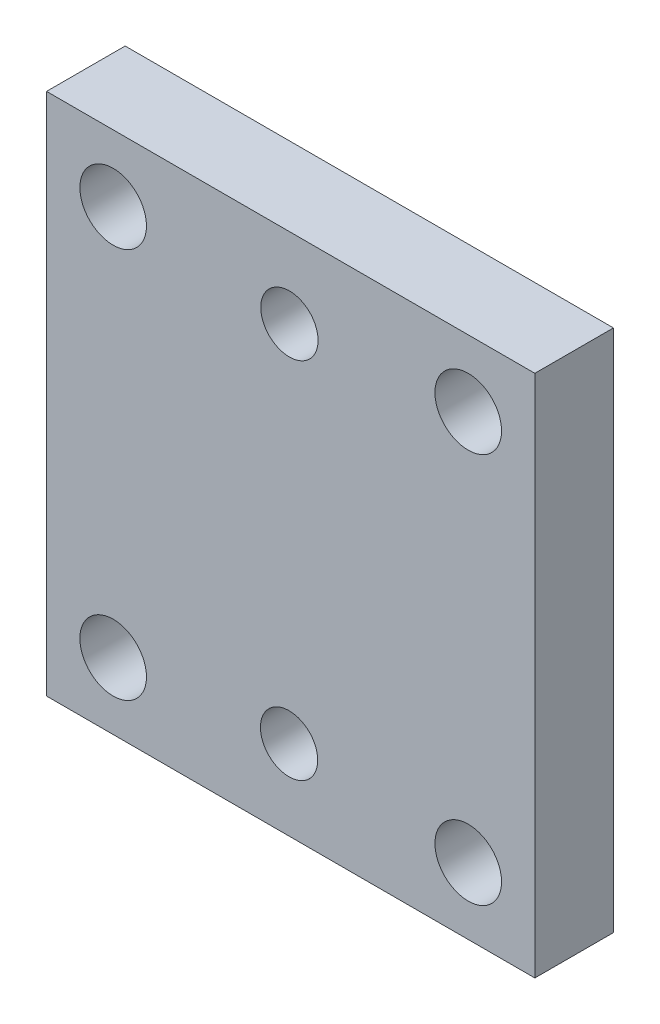
ISO-10303-21;
HEADER;
FILE_DESCRIPTION(('STEP AP214'),'2;1');
FILE_NAME('part.step','',(''),(''),'','','');
FILE_SCHEMA(('AUTOMOTIVE_DESIGN { 1 0 10303 214 1 1 1 1 }'));
ENDSEC;
DATA;
#1=APPLICATION_CONTEXT('core data for automotive mechanical design processes');
#2=APPLICATION_PROTOCOL_DEFINITION('international standard','automotive_design',2000,#1);
#3=PRODUCT_CONTEXT('',#1,'mechanical');
#4=PRODUCT('Part','Part','',(#3));
#5=PRODUCT_RELATED_PRODUCT_CATEGORY('part','',(#4));
#6=PRODUCT_DEFINITION_FORMATION('','',#4);
#7=PRODUCT_DEFINITION_CONTEXT('part definition',#1,'design');
#8=PRODUCT_DEFINITION('design','',#6,#7);
#9=PRODUCT_DEFINITION_SHAPE('','',#8);
#10=(LENGTH_UNIT() NAMED_UNIT(*) SI_UNIT(.MILLI.,.METRE.));
#11=(NAMED_UNIT(*) PLANE_ANGLE_UNIT() SI_UNIT($,.RADIAN.));
#12=(NAMED_UNIT(*) SI_UNIT($,.STERADIAN.) SOLID_ANGLE_UNIT());
#13=UNCERTAINTY_MEASURE_WITH_UNIT(LENGTH_MEASURE(1.E-05),#10,'distance_accuracy_value','');
#14=(GEOMETRIC_REPRESENTATION_CONTEXT(3) GLOBAL_UNCERTAINTY_ASSIGNED_CONTEXT((#13)) GLOBAL_UNIT_ASSIGNED_CONTEXT((#10,
#11,#12)) REPRESENTATION_CONTEXT('',''));
#15=CARTESIAN_POINT('',(0.,0.,0.));
#16=DIRECTION('',(0.,0.,1.));
#17=DIRECTION('',(1.,0.,0.));
#18=AXIS2_PLACEMENT_3D('',#15,#16,#17);
#19=CARTESIAN_POINT('',(0.,0.,4.));
#20=DIRECTION('',(0.,0.,1.));
#21=DIRECTION('',(1.,0.,0.));
#22=AXIS2_PLACEMENT_3D('',#19,#20,#21);
#23=PLANE('',#22);
#24=CARTESIAN_POINT('',(12.941789835739,-14.6563,4.));
#25=DIRECTION('',(0.,0.,1.));
#26=DIRECTION('',(1.,0.,0.));
#27=AXIS2_PLACEMENT_3D('',#24,#25,#26);
#28=CIRCLE('',#27,2.5);
#29=CARTESIAN_POINT('',(15.441789835739,-14.6563,4.));
#30=VERTEX_POINT('',#29);
#31=EDGE_CURVE('E246',#30,#30,#28,.F.);
#32=ORIENTED_EDGE('',*,*,#31,.T.);
#33=EDGE_LOOP('',(#32));
#34=FACE_BOUND('',#33,.T.);
#35=CARTESIAN_POINT('',(-13.7132,-14.6563,4.));
#36=DIRECTION('',(0.,0.,1.));
#37=DIRECTION('',(1.,0.,0.));
#38=AXIS2_PLACEMENT_3D('',#35,#36,#37);
#39=CIRCLE('',#38,2.5);
#40=CARTESIAN_POINT('',(-11.2132,-14.6563,4.));
#41=VERTEX_POINT('',#40);
#42=EDGE_CURVE('E258',#41,#41,#39,.F.);
#43=ORIENTED_EDGE('',*,*,#42,.T.);
#44=EDGE_LOOP('',(#43));
#45=FACE_BOUND('',#44,.T.);
#46=CARTESIAN_POINT('',(-13.7132,14.6563,4.));
#47=DIRECTION('',(0.,0.,1.));
#48=DIRECTION('',(1.,0.,0.));
#49=AXIS2_PLACEMENT_3D('',#46,#47,#48);
#50=CIRCLE('',#49,2.5);
#51=CARTESIAN_POINT('',(-11.2132,14.6563,4.));
#52=VERTEX_POINT('',#51);
#53=EDGE_CURVE('E250',#52,#52,#50,.F.);
#54=ORIENTED_EDGE('',*,*,#53,.T.);
#55=EDGE_LOOP('',(#54));
#56=FACE_BOUND('',#55,.T.);
#57=CARTESIAN_POINT('',(12.941789835739,14.6563,4.));
#58=DIRECTION('',(0.,0.,1.));
#59=DIRECTION('',(1.,0.,0.));
#60=AXIS2_PLACEMENT_3D('',#57,#58,#59);
#61=CIRCLE('',#60,2.5);
#62=CARTESIAN_POINT('',(15.441789835739,14.6563,4.));
#63=VERTEX_POINT('',#62);
#64=EDGE_CURVE('E270',#63,#63,#61,.F.);
#65=ORIENTED_EDGE('',*,*,#64,.T.);
#66=EDGE_LOOP('',(#65));
#67=FACE_BOUND('',#66,.T.);
#68=CARTESIAN_POINT('',(-0.4826,13.6525,4.));
#69=DIRECTION('',(0.,0.,1.));
#70=DIRECTION('',(1.,0.,0.));
#71=AXIS2_PLACEMENT_3D('',#68,#69,#70);
#72=CIRCLE('',#71,2.15);
#73=CARTESIAN_POINT('',(1.6674,13.6525,4.));
#74=VERTEX_POINT('',#73);
#75=EDGE_CURVE('E434',#74,#74,#72,.T.);
#76=ORIENTED_EDGE('',*,*,#75,.F.);
#77=EDGE_LOOP('',(#76));
#78=FACE_BOUND('',#77,.T.);
#79=DIRECTION('',(0.,-1.,0.));
#80=VECTOR('',#79,1.);
#81=CARTESIAN_POINT('',(-18.7132,19.6563,4.));
#82=LINE('',#81,#80);
#83=CARTESIAN_POINT('',(-18.7132,19.6563,4.));
#84=VERTEX_POINT('',#83);
#85=CARTESIAN_POINT('',(-18.7132,-19.6563,4.));
#86=VERTEX_POINT('',#85);
#87=EDGE_CURVE('E437',#84,#86,#82,.T.);
#88=ORIENTED_EDGE('',*,*,#87,.T.);
#89=DIRECTION('',(1.,0.,0.));
#90=VECTOR('',#89,1.);
#91=CARTESIAN_POINT('',(-18.7132,-19.6563,4.));
#92=LINE('',#91,#90);
#93=CARTESIAN_POINT('',(17.941789835739,-19.6563,4.));
#94=VERTEX_POINT('',#93);
#95=EDGE_CURVE('E442',#86,#94,#92,.T.);
#96=ORIENTED_EDGE('',*,*,#95,.T.);
#97=DIRECTION('',(0.,1.,0.));
#98=VECTOR('',#97,1.);
#99=CARTESIAN_POINT('',(17.941789835739,19.6563,4.));
#100=LINE('',#99,#98);
#101=CARTESIAN_POINT('',(17.941789835739,19.6563,4.));
#102=VERTEX_POINT('',#101);
#103=EDGE_CURVE('E444',#94,#102,#100,.T.);
#104=ORIENTED_EDGE('',*,*,#103,.T.);
#105=DIRECTION('',(-1.,0.,0.));
#106=VECTOR('',#105,1.);
#107=CARTESIAN_POINT('',(-18.7132,19.6563,4.));
#108=LINE('',#107,#106);
#109=EDGE_CURVE('E446',#102,#84,#108,.T.);
#110=ORIENTED_EDGE('',*,*,#109,.T.);
#111=EDGE_LOOP('',(#88,#96,#104,#110));
#112=FACE_BOUND('',#111,.T.);
#113=CARTESIAN_POINT('',(-0.508000000000008,-13.6525,4.));
#114=DIRECTION('',(0.,0.,1.));
#115=DIRECTION('',(1.,0.,0.));
#116=AXIS2_PLACEMENT_3D('',#113,#114,#115);
#117=CIRCLE('',#116,2.15);
#118=CARTESIAN_POINT('',(1.64199999999999,-13.6525,4.));
#119=VERTEX_POINT('',#118);
#120=EDGE_CURVE('E428',#119,#119,#117,.T.);
#121=ORIENTED_EDGE('',*,*,#120,.F.);
#122=EDGE_LOOP('',(#121));
#123=FACE_BOUND('',#122,.T.);
#124=ADVANCED_FACE('F38',(#34,#45,#56,#67,#78,#112,#123),#23,.T.);
#125=CARTESIAN_POINT('',(0.,0.,0.));
#126=DIRECTION('',(0.,0.,1.));
#127=DIRECTION('',(1.,0.,0.));
#128=AXIS2_PLACEMENT_3D('',#125,#126,#127);
#129=PLANE('',#128);
#130=DIRECTION('',(-1.,0.,0.));
#131=VECTOR('',#130,1.);
#132=CARTESIAN_POINT('',(-7.82200000000001,-5.8375,0.));
#133=LINE('',#132,#131);
#134=CARTESIAN_POINT('',(-7.82200000000001,-5.8375,0.));
#135=VERTEX_POINT('',#134);
#136=CARTESIAN_POINT('',(-16.7132,-5.8375,0.));
#137=VERTEX_POINT('',#136);
#138=EDGE_CURVE('E240',#135,#137,#133,.T.);
#139=ORIENTED_EDGE('',*,*,#138,.F.);
#140=DIRECTION('',(0.,-1.,0.));
#141=VECTOR('',#140,1.);
#142=CARTESIAN_POINT('',(-7.82200000000001,5.26504,0.));
#143=LINE('',#142,#141);
#144=CARTESIAN_POINT('',(-7.82200000000001,5.26504,0.));
#145=VERTEX_POINT('',#144);
#146=EDGE_CURVE('E53',#145,#135,#143,.T.);
#147=ORIENTED_EDGE('',*,*,#146,.F.);
#148=DIRECTION('',(1.,0.,0.));
#149=VECTOR('',#148,1.);
#150=CARTESIAN_POINT('',(-7.82200000000001,5.26504,0.));
#151=LINE('',#150,#149);
#152=CARTESIAN_POINT('',(-16.7132,5.26504,0.));
#153=VERTEX_POINT('',#152);
#154=EDGE_CURVE('E231',#153,#145,#151,.T.);
#155=ORIENTED_EDGE('',*,*,#154,.F.);
#156=DIRECTION('',(0.,1.,0.));
#157=VECTOR('',#156,1.);
#158=CARTESIAN_POINT('',(-16.7132,5.26504,0.));
#159=LINE('',#158,#157);
#160=EDGE_CURVE('E234',#137,#153,#159,.T.);
#161=ORIENTED_EDGE('',*,*,#160,.F.);
#162=EDGE_LOOP('',(#139,#147,#155,#161));
#163=FACE_BOUND('',#162,.T.);
#164=DIRECTION('',(0.707106781186548,-0.707106781186547,0.));
#165=VECTOR('',#164,1.);
#166=CARTESIAN_POINT('',(6.46488542494923,10.4965,0.));
#167=LINE('',#166,#165);
#168=CARTESIAN_POINT('',(4.92119999999999,12.0401854249492,0.));
#169=VERTEX_POINT('',#168);
#170=CARTESIAN_POINT('',(6.46488542494923,10.4965,0.));
#171=VERTEX_POINT('',#170);
#172=EDGE_CURVE('E382',#169,#171,#167,.T.);
#173=ORIENTED_EDGE('',*,*,#172,.T.);
#174=DIRECTION('',(1.,0.,0.));
#175=VECTOR('',#174,1.);
#176=CARTESIAN_POINT('',(17.1132,10.4965,0.));
#177=LINE('',#176,#175);
#178=CARTESIAN_POINT('',(17.1132,10.4965,0.));
#179=VERTEX_POINT('',#178);
#180=EDGE_CURVE('E385',#171,#179,#177,.T.);
#181=ORIENTED_EDGE('',*,*,#180,.T.);
#182=DIRECTION('',(0.,-1.,0.));
#183=VECTOR('',#182,1.);
#184=CARTESIAN_POINT('',(17.1132,10.4965,0.));
#185=LINE('',#184,#183);
#186=CARTESIAN_POINT('',(17.1132,-0.000300188103411017,0.));
#187=VERTEX_POINT('',#186);
#188=EDGE_CURVE('E336',#179,#187,#185,.T.);
#189=ORIENTED_EDGE('',*,*,#188,.T.);
#190=DIRECTION('',(0.000724575781798469,-0.999999737494934,0.));
#191=VECTOR('',#190,1.);
#192=CARTESIAN_POINT('',(17.1208057272027,-10.4970976207436,0.));
#193=LINE('',#192,#191);
#194=CARTESIAN_POINT('',(17.1208057272027,-10.4970976207436,0.));
#195=VERTEX_POINT('',#194);
#196=EDGE_CURVE('E61',#187,#195,#193,.T.);
#197=ORIENTED_EDGE('',*,*,#196,.T.);
#198=DIRECTION('',(-0.999999737494934,-0.00072457578179884,0.));
#199=VECTOR('',#198,1.);
#200=CARTESIAN_POINT('',(17.1208057272027,-10.4970976207436,0.));
#201=LINE('',#200,#199);
#202=CARTESIAN_POINT('',(6.47249394738843,-10.5048131316017,0.));
#203=VERTEX_POINT('',#202);
#204=EDGE_CURVE('E340',#195,#203,#201,.T.);
#205=ORIENTED_EDGE('',*,*,#204,.T.);
#206=DIRECTION('',(-0.706594243118643,-0.707618948016227,0.));
#207=VECTOR('',#206,1.);
#208=CARTESIAN_POINT('',(6.47249394738843,-10.5048131316017,0.));
#209=LINE('',#208,#207);
#210=CARTESIAN_POINT('',(4.92992744473807,-12.0496166683993,0.));
#211=VERTEX_POINT('',#210);
#212=EDGE_CURVE('E343',#203,#211,#209,.T.);
#213=ORIENTED_EDGE('',*,*,#212,.T.);
#214=DIRECTION('',(0.000724575781799239,-0.999999737494934,0.));
#215=VECTOR('',#214,1.);
#216=CARTESIAN_POINT('',(4.9310956888318,-13.6619308202093,0.));
#217=LINE('',#216,#215);
#218=CARTESIAN_POINT('',(4.9310956888318,-13.6619308202093,0.));
#219=VERTEX_POINT('',#218);
#220=EDGE_CURVE('E346',#211,#219,#217,.T.);
#221=ORIENTED_EDGE('',*,*,#220,.T.);
#222=CARTESIAN_POINT('',(-0.498102885975697,-13.6658646870438,0.));
#223=DIRECTION('',(0.,0.,-1.));
#224=DIRECTION('',(-1.,0.,0.));
#225=AXIS2_PLACEMENT_3D('',#222,#223,#224);
#226=CIRCLE('',#225,5.4292);
#227=CARTESIAN_POINT('',(-5.92730146078319,-13.6697985538784,0.));
#228=VERTEX_POINT('',#227);
#229=EDGE_CURVE('E349',#219,#228,#226,.T.);
#230=ORIENTED_EDGE('',*,*,#229,.T.);
#231=DIRECTION('',(-0.00072457578179924,0.999999737494934,0.));
#232=VECTOR('',#231,1.);
#233=CARTESIAN_POINT('',(-5.92730146078319,-13.6697985538784,0.));
#234=LINE('',#233,#232);
#235=CARTESIAN_POINT('',(-5.92846970487691,-12.0574844020684,0.));
#236=VERTEX_POINT('',#235);
#237=EDGE_CURVE('E352',#228,#236,#234,.T.);
#238=ORIENTED_EDGE('',*,*,#237,.T.);
#239=DIRECTION('',(-0.707618948016229,0.706594243118641,0.));
#240=VECTOR('',#239,1.);
#241=CARTESIAN_POINT('',(-5.92846970487691,-12.0574844020684,0.));
#242=LINE('',#241,#240);
#243=CARTESIAN_POINT('',(-7.47327324167454,-10.514917899418,0.));
#244=VERTEX_POINT('',#243);
#245=EDGE_CURVE('E355',#236,#244,#242,.T.);
#246=ORIENTED_EDGE('',*,*,#245,.T.);
#247=DIRECTION('',(-0.999999737494934,-0.000724575781799205,0.));
#248=VECTOR('',#247,1.);
#249=CARTESIAN_POINT('',(-7.47327324167454,-10.514917899418,0.));
#250=LINE('',#249,#248);
#251=CARTESIAN_POINT('',(-17.1055852881939,-10.5218972412818,0.));
#252=VERTEX_POINT('',#251);
#253=EDGE_CURVE('E358',#244,#252,#250,.T.);
#254=ORIENTED_EDGE('',*,*,#253,.T.);
#255=DIRECTION('',(-0.0007245757817987,0.999999737494934,0.));
#256=VECTOR('',#255,1.);
#257=CARTESIAN_POINT('',(-17.1055852881939,-10.5218972412818,0.));
#258=LINE('',#257,#256);
#259=CARTESIAN_POINT('',(-17.1132,-0.0126999999999974,0.));
#260=VERTEX_POINT('',#259);
#261=EDGE_CURVE('E361',#252,#260,#258,.T.);
#262=ORIENTED_EDGE('',*,*,#261,.T.);
#263=DIRECTION('',(0.,1.,0.));
#264=VECTOR('',#263,1.);
#265=CARTESIAN_POINT('',(-17.1132,10.4965,0.));
#266=LINE('',#265,#264);
#267=CARTESIAN_POINT('',(-17.1132,10.4965,0.));
#268=VERTEX_POINT('',#267);
#269=EDGE_CURVE('E364',#260,#268,#266,.T.);
#270=ORIENTED_EDGE('',*,*,#269,.T.);
#271=DIRECTION('',(1.,0.,0.));
#272=VECTOR('',#271,1.);
#273=CARTESIAN_POINT('',(-7.48088542494925,10.4965,0.));
#274=LINE('',#273,#272);
#275=CARTESIAN_POINT('',(-7.48088542494925,10.4965,0.));
#276=VERTEX_POINT('',#275);
#277=EDGE_CURVE('E367',#268,#276,#274,.T.);
#278=ORIENTED_EDGE('',*,*,#277,.T.);
#279=DIRECTION('',(0.707106781186548,0.707106781186547,0.));
#280=VECTOR('',#279,1.);
#281=CARTESIAN_POINT('',(-5.93720000000001,12.0401854249492,0.));
#282=LINE('',#281,#280);
#283=CARTESIAN_POINT('',(-5.93720000000001,12.0401854249492,0.));
#284=VERTEX_POINT('',#283);
#285=EDGE_CURVE('E370',#276,#284,#282,.T.);
#286=ORIENTED_EDGE('',*,*,#285,.T.);
#287=DIRECTION('',(0.,1.,0.));
#288=VECTOR('',#287,1.);
#289=CARTESIAN_POINT('',(-5.93720000000001,13.6525,0.));
#290=LINE('',#289,#288);
#291=CARTESIAN_POINT('',(-5.93720000000001,13.6525,0.));
#292=VERTEX_POINT('',#291);
#293=EDGE_CURVE('E373',#284,#292,#290,.T.);
#294=ORIENTED_EDGE('',*,*,#293,.T.);
#295=CARTESIAN_POINT('',(-0.508000000000008,13.6525,0.));
#296=DIRECTION('',(0.,0.,-1.));
#297=DIRECTION('',(1.,0.,0.));
#298=AXIS2_PLACEMENT_3D('',#295,#296,#297);
#299=CIRCLE('',#298,5.4292);
#300=CARTESIAN_POINT('',(4.92119999999999,13.6525,0.));
#301=VERTEX_POINT('',#300);
#302=EDGE_CURVE('E376',#292,#301,#299,.T.);
#303=ORIENTED_EDGE('',*,*,#302,.T.);
#304=DIRECTION('',(0.,-1.,0.));
#305=VECTOR('',#304,1.);
#306=CARTESIAN_POINT('',(4.92119999999999,13.6525,0.));
#307=LINE('',#306,#305);
#308=EDGE_CURVE('E379',#301,#169,#307,.T.);
#309=ORIENTED_EDGE('',*,*,#308,.T.);
#310=EDGE_LOOP('',(#173,#181,#189,#197,#205,#213,#221,#230,#238,#246,#254,#262,#270,#278,#286,
#294,#303,#309));
#311=FACE_BOUND('',#310,.T.);
#312=CARTESIAN_POINT('',(-0.4826,13.6525,0.));
#313=DIRECTION('',(0.,0.,1.));
#314=DIRECTION('',(1.,0.,0.));
#315=AXIS2_PLACEMENT_3D('',#312,#313,#314);
#316=CIRCLE('',#315,2.15);
#317=CARTESIAN_POINT('',(1.6674,13.6525,0.));
#318=VERTEX_POINT('',#317);
#319=EDGE_CURVE('E431',#318,#318,#316,.T.);
#320=ORIENTED_EDGE('',*,*,#319,.T.);
#321=EDGE_LOOP('',(#320));
#322=FACE_BOUND('',#321,.T.);
#323=CARTESIAN_POINT('',(-0.508000000000008,-13.6525,0.));
#324=DIRECTION('',(0.,0.,1.));
#325=DIRECTION('',(1.,0.,0.));
#326=AXIS2_PLACEMENT_3D('',#323,#324,#325);
#327=CIRCLE('',#326,2.15);
#328=CARTESIAN_POINT('',(1.64199999999999,-13.6525,0.));
#329=VERTEX_POINT('',#328);
#330=EDGE_CURVE('E427',#329,#329,#327,.T.);
#331=ORIENTED_EDGE('',*,*,#330,.T.);
#332=EDGE_LOOP('',(#331));
#333=FACE_BOUND('',#332,.T.);
#334=ADVANCED_FACE('F474',(#163,#311,#322,#333),#129,.F.);
#335=CARTESIAN_POINT('',(-18.7132,19.6563,4.));
#336=DIRECTION('',(1.,0.,0.));
#337=DIRECTION('',(0.,1.,0.));
#338=AXIS2_PLACEMENT_3D('',#335,#336,#337);
#339=PLANE('',#338);
#340=DIRECTION('',(0.,0.,-1.));
#341=VECTOR('',#340,1.);
#342=CARTESIAN_POINT('',(-18.7132,19.6563,4.));
#343=LINE('',#342,#341);
#344=CARTESIAN_POINT('',(-18.7132,19.6563,-1.90000001490102));
#345=VERTEX_POINT('',#344);
#346=EDGE_CURVE('E448',#84,#345,#343,.T.);
#347=ORIENTED_EDGE('',*,*,#346,.T.);
#348=DIRECTION('',(0.,1.,0.));
#349=VECTOR('',#348,1.);
#350=CARTESIAN_POINT('',(-18.7132,19.6563,-1.90000001490105));
#351=LINE('',#350,#349);
#352=CARTESIAN_POINT('',(-18.7132,-19.6563,-1.90000001490107));
#353=VERTEX_POINT('',#352);
#354=EDGE_CURVE('E327',#353,#345,#351,.T.);
#355=ORIENTED_EDGE('',*,*,#354,.F.);
#356=DIRECTION('',(0.,0.,-1.));
#357=VECTOR('',#356,1.);
#358=CARTESIAN_POINT('',(-18.7132,-19.6563,4.));
#359=LINE('',#358,#357);
#360=EDGE_CURVE('E12',#86,#353,#359,.T.);
#361=ORIENTED_EDGE('',*,*,#360,.F.);
#362=ORIENTED_EDGE('',*,*,#87,.F.);
#363=EDGE_LOOP('',(#347,#355,#361,#362));
#364=FACE_BOUND('',#363,.T.);
#365=ADVANCED_FACE('F40',(#364),#339,.F.);
#366=CARTESIAN_POINT('',(-18.7132,-19.6563,4.));
#367=DIRECTION('',(0.,1.,0.));
#368=DIRECTION('',(0.,0.,1.));
#369=AXIS2_PLACEMENT_3D('',#366,#367,#368);
#370=PLANE('',#369);
#371=ORIENTED_EDGE('',*,*,#360,.T.);
#372=DIRECTION('',(-1.,0.,0.));
#373=VECTOR('',#372,1.);
#374=CARTESIAN_POINT('',(17.9417898357389,-19.6563,-1.90000001490098));
#375=LINE('',#374,#373);
#376=CARTESIAN_POINT('',(17.941789835739,-19.6563,-1.90000001490102));
#377=VERTEX_POINT('',#376);
#378=EDGE_CURVE('E330',#377,#353,#375,.T.);
#379=ORIENTED_EDGE('',*,*,#378,.F.);
#380=DIRECTION('',(0.,0.,-1.));
#381=VECTOR('',#380,1.);
#382=CARTESIAN_POINT('',(17.941789835739,-19.6563,4.));
#383=LINE('',#382,#381);
#384=EDGE_CURVE('E46',#94,#377,#383,.T.);
#385=ORIENTED_EDGE('',*,*,#384,.F.);
#386=ORIENTED_EDGE('',*,*,#95,.F.);
#387=EDGE_LOOP('',(#371,#379,#385,#386));
#388=FACE_BOUND('',#387,.T.);
#389=ADVANCED_FACE('F459',(#388),#370,.F.);
#390=CARTESIAN_POINT('',(17.941789835739,19.6563,4.));
#391=DIRECTION('',(-1.,0.,0.));
#392=DIRECTION('',(0.,-1.,0.));
#393=AXIS2_PLACEMENT_3D('',#390,#391,#392);
#394=PLANE('',#393);
#395=ORIENTED_EDGE('',*,*,#384,.T.);
#396=DIRECTION('',(0.,-1.,0.));
#397=VECTOR('',#396,1.);
#398=CARTESIAN_POINT('',(17.941789835739,19.6563,-1.90000001490098));
#399=LINE('',#398,#397);
#400=CARTESIAN_POINT('',(17.941789835739,19.6563,-1.90000001490098));
#401=VERTEX_POINT('',#400);
#402=EDGE_CURVE('E333',#401,#377,#399,.T.);
#403=ORIENTED_EDGE('',*,*,#402,.F.);
#404=DIRECTION('',(0.,0.,-1.));
#405=VECTOR('',#404,1.);
#406=CARTESIAN_POINT('',(17.941789835739,19.6563,4.));
#407=LINE('',#406,#405);
#408=EDGE_CURVE('E450',#102,#401,#407,.T.);
#409=ORIENTED_EDGE('',*,*,#408,.F.);
#410=ORIENTED_EDGE('',*,*,#103,.F.);
#411=EDGE_LOOP('',(#395,#403,#409,#410));
#412=FACE_BOUND('',#411,.T.);
#413=ADVANCED_FACE('F456',(#412),#394,.F.);
#414=CARTESIAN_POINT('',(-18.7132,19.6563,4.));
#415=DIRECTION('',(0.,-1.,0.));
#416=DIRECTION('',(0.,0.,-1.));
#417=AXIS2_PLACEMENT_3D('',#414,#415,#416);
#418=PLANE('',#417);
#419=ORIENTED_EDGE('',*,*,#408,.T.);
#420=DIRECTION('',(1.,0.,0.));
#421=VECTOR('',#420,1.);
#422=CARTESIAN_POINT('',(17.9417898357389,19.6563,-1.90000001490098));
#423=LINE('',#422,#421);
#424=EDGE_CURVE('E324',#345,#401,#423,.T.);
#425=ORIENTED_EDGE('',*,*,#424,.F.);
#426=ORIENTED_EDGE('',*,*,#346,.F.);
#427=ORIENTED_EDGE('',*,*,#109,.F.);
#428=EDGE_LOOP('',(#419,#425,#426,#427));
#429=FACE_BOUND('',#428,.T.);
#430=ADVANCED_FACE('F467',(#429),#418,.F.);
#431=CARTESIAN_POINT('',(-0.4826,13.6525,4.));
#432=DIRECTION('',(0.,0.,-1.));
#433=DIRECTION('',(-1.,0.,0.));
#434=AXIS2_PLACEMENT_3D('',#431,#432,#433);
#435=CYLINDRICAL_SURFACE('',#434,2.15);
#436=ORIENTED_EDGE('',*,*,#75,.T.);
#437=EDGE_LOOP('',(#436));
#438=FACE_BOUND('',#437,.T.);
#439=ORIENTED_EDGE('',*,*,#319,.F.);
#440=EDGE_LOOP('',(#439));
#441=FACE_BOUND('',#440,.T.);
#442=ADVANCED_FACE('F488',(#438,#441),#435,.F.);
#443=CARTESIAN_POINT('',(-0.508000000000008,-13.6525,4.));
#444=DIRECTION('',(0.,0.,-1.));
#445=DIRECTION('',(-1.,0.,0.));
#446=AXIS2_PLACEMENT_3D('',#443,#444,#445);
#447=CYLINDRICAL_SURFACE('',#446,2.15);
#448=ORIENTED_EDGE('',*,*,#120,.T.);
#449=EDGE_LOOP('',(#448));
#450=FACE_BOUND('',#449,.T.);
#451=ORIENTED_EDGE('',*,*,#330,.F.);
#452=EDGE_LOOP('',(#451));
#453=FACE_BOUND('',#452,.T.);
#454=ADVANCED_FACE('F509',(#450,#453),#447,.F.);
#455=CARTESIAN_POINT('',(17.1132,10.4965,-56.3500586066656));
#456=DIRECTION('',(0.,-1.,0.));
#457=DIRECTION('',(1.,0.,0.));
#458=AXIS2_PLACEMENT_3D('',#455,#456,#457);
#459=PLANE('',#458);
#460=DIRECTION('',(0.,0.,1.));
#461=VECTOR('',#460,1.);
#462=CARTESIAN_POINT('',(6.46488542494923,10.4965,-56.3500586066656));
#463=LINE('',#462,#461);
#464=CARTESIAN_POINT('',(6.46488542494923,10.4965,-1.900000014901));
#465=VERTEX_POINT('',#464);
#466=EDGE_CURVE('E390',#465,#171,#463,.T.);
#467=ORIENTED_EDGE('',*,*,#466,.F.);
#468=DIRECTION('',(1.,0.,0.));
#469=VECTOR('',#468,1.);
#470=CARTESIAN_POINT('',(17.1131999999999,10.4965,-1.90000001490098));
#471=LINE('',#470,#469);
#472=CARTESIAN_POINT('',(17.1132,10.4965,-1.900000014901));
#473=VERTEX_POINT('',#472);
#474=EDGE_CURVE('E424',#465,#473,#471,.T.);
#475=ORIENTED_EDGE('',*,*,#474,.T.);
#476=DIRECTION('',(0.,0.,1.));
#477=VECTOR('',#476,1.);
#478=CARTESIAN_POINT('',(17.1132,10.4965,-56.3500586066656));
#479=LINE('',#478,#477);
#480=EDGE_CURVE('E388',#473,#179,#479,.T.);
#481=ORIENTED_EDGE('',*,*,#480,.T.);
#482=ORIENTED_EDGE('',*,*,#180,.F.);
#483=EDGE_LOOP('',(#467,#475,#481,#482));
#484=FACE_BOUND('',#483,.T.);
#485=ADVANCED_FACE('F516',(#484),#459,.T.);
#486=CARTESIAN_POINT('',(6.46488542494923,10.4965,-56.3500586066656));
#487=DIRECTION('',(-0.707106781186547,-0.707106781186548,0.));
#488=DIRECTION('',(0.707106781186548,-0.707106781186547,0.));
#489=AXIS2_PLACEMENT_3D('',#486,#487,#488);
#490=PLANE('',#489);
#491=DIRECTION('',(0.,0.,1.));
#492=VECTOR('',#491,1.);
#493=CARTESIAN_POINT('',(4.92119999999999,12.0401854249492,-56.3500586066656));
#494=LINE('',#493,#492);
#495=CARTESIAN_POINT('',(4.92119999999999,12.0401854249492,-1.900000014901));
#496=VERTEX_POINT('',#495);
#497=EDGE_CURVE('E392',#496,#169,#494,.T.);
#498=ORIENTED_EDGE('',*,*,#497,.F.);
#499=DIRECTION('',(0.707106781186548,-0.707106781186547,0.));
#500=VECTOR('',#499,1.);
#501=CARTESIAN_POINT('',(6.46488542494917,10.4965000000001,-1.900000014901));
#502=LINE('',#501,#500);
#503=EDGE_CURVE('E273',#496,#465,#502,.T.);
#504=ORIENTED_EDGE('',*,*,#503,.T.);
#505=ORIENTED_EDGE('',*,*,#466,.T.);
#506=ORIENTED_EDGE('',*,*,#172,.F.);
#507=EDGE_LOOP('',(#498,#504,#505,#506));
#508=FACE_BOUND('',#507,.T.);
#509=ADVANCED_FACE('F522',(#508),#490,.T.);
#510=CARTESIAN_POINT('',(4.92119999999999,13.6525,-56.3500586066656));
#511=DIRECTION('',(-1.,0.,0.));
#512=DIRECTION('',(0.,0.,1.));
#513=AXIS2_PLACEMENT_3D('',#510,#511,#512);
#514=PLANE('',#513);
#515=DIRECTION('',(0.,0.,1.));
#516=VECTOR('',#515,1.);
#517=CARTESIAN_POINT('',(4.92119999999999,13.6525,-56.3500586066656));
#518=LINE('',#517,#516);
#519=CARTESIAN_POINT('',(4.92119999999999,13.6525,-1.900000014901));
#520=VERTEX_POINT('',#519);
#521=EDGE_CURVE('E394',#520,#301,#518,.T.);
#522=ORIENTED_EDGE('',*,*,#521,.F.);
#523=DIRECTION('',(0.,-1.,0.));
#524=VECTOR('',#523,1.);
#525=CARTESIAN_POINT('',(4.92119999999999,13.6525,-1.900000014901));
#526=LINE('',#525,#524);
#527=EDGE_CURVE('E276',#520,#496,#526,.T.);
#528=ORIENTED_EDGE('',*,*,#527,.T.);
#529=ORIENTED_EDGE('',*,*,#497,.T.);
#530=ORIENTED_EDGE('',*,*,#308,.F.);
#531=EDGE_LOOP('',(#522,#528,#529,#530));
#532=FACE_BOUND('',#531,.T.);
#533=ADVANCED_FACE('F530',(#532),#514,.T.);
#534=CARTESIAN_POINT('',(-0.508000000000008,13.6525,-56.3500586066656));
#535=DIRECTION('',(0.,0.,1.));
#536=DIRECTION('',(1.,0.,0.));
#537=AXIS2_PLACEMENT_3D('',#534,#535,#536);
#538=CYLINDRICAL_SURFACE('',#537,5.4292);
#539=DIRECTION('',(0.,0.,1.));
#540=VECTOR('',#539,1.);
#541=CARTESIAN_POINT('',(-5.93720000000001,13.6525,-56.3500586066656));
#542=LINE('',#541,#540);
#543=CARTESIAN_POINT('',(-5.93720000000001,13.6525,-1.90000001490102));
#544=VERTEX_POINT('',#543);
#545=EDGE_CURVE('E396',#544,#292,#542,.T.);
#546=ORIENTED_EDGE('',*,*,#545,.F.);
#547=CARTESIAN_POINT('',(-0.508000000000008,13.6525,-1.90000001490101));
#548=DIRECTION('',(0.,0.,-1.));
#549=DIRECTION('',(-1.,0.,0.));
#550=AXIS2_PLACEMENT_3D('',#547,#548,#549);
#551=CIRCLE('',#550,5.4292);
#552=EDGE_CURVE('E279',#544,#520,#551,.T.);
#553=ORIENTED_EDGE('',*,*,#552,.T.);
#554=ORIENTED_EDGE('',*,*,#521,.T.);
#555=ORIENTED_EDGE('',*,*,#302,.F.);
#556=EDGE_LOOP('',(#546,#553,#554,#555));
#557=FACE_BOUND('',#556,.T.);
#558=ADVANCED_FACE('F538',(#557),#538,.F.);
#559=CARTESIAN_POINT('',(-5.93720000000001,13.6525,-56.3500586066656));
#560=DIRECTION('',(1.,0.,0.));
#561=DIRECTION('',(0.,0.,-1.));
#562=AXIS2_PLACEMENT_3D('',#559,#560,#561);
#563=PLANE('',#562);
#564=DIRECTION('',(0.,0.,1.));
#565=VECTOR('',#564,1.);
#566=CARTESIAN_POINT('',(-5.93720000000001,12.0401854249492,-56.3500586066656));
#567=LINE('',#566,#565);
#568=CARTESIAN_POINT('',(-5.93720000000001,12.0401854249492,-1.90000001490102));
#569=VERTEX_POINT('',#568);
#570=EDGE_CURVE('E398',#569,#284,#567,.T.);
#571=ORIENTED_EDGE('',*,*,#570,.F.);
#572=DIRECTION('',(0.,1.,0.));
#573=VECTOR('',#572,1.);
#574=CARTESIAN_POINT('',(-5.93720000000001,13.6525,-1.90000001490102));
#575=LINE('',#574,#573);
#576=EDGE_CURVE('E282',#569,#544,#575,.T.);
#577=ORIENTED_EDGE('',*,*,#576,.T.);
#578=ORIENTED_EDGE('',*,*,#545,.T.);
#579=ORIENTED_EDGE('',*,*,#293,.F.);
#580=EDGE_LOOP('',(#571,#577,#578,#579));
#581=FACE_BOUND('',#580,.T.);
#582=ADVANCED_FACE('F546',(#581),#563,.T.);
#583=CARTESIAN_POINT('',(-5.93720000000001,12.0401854249492,-56.3500586066656));
#584=DIRECTION('',(0.707106781186547,-0.707106781186548,0.));
#585=DIRECTION('',(0.707106781186548,0.707106781186547,0.));
#586=AXIS2_PLACEMENT_3D('',#583,#584,#585);
#587=PLANE('',#586);
#588=DIRECTION('',(0.,0.,1.));
#589=VECTOR('',#588,1.);
#590=CARTESIAN_POINT('',(-7.48088542494925,10.4965,-56.3500586066656));
#591=LINE('',#590,#589);
#592=CARTESIAN_POINT('',(-7.48088542494925,10.4965,-1.90000001490103));
#593=VERTEX_POINT('',#592);
#594=EDGE_CURVE('E400',#593,#276,#591,.T.);
#595=ORIENTED_EDGE('',*,*,#594,.F.);
#596=DIRECTION('',(0.707106781186548,0.707106781186547,0.));
#597=VECTOR('',#596,1.);
#598=CARTESIAN_POINT('',(-5.93720000000006,12.0401854249492,-1.90000001490102));
#599=LINE('',#598,#597);
#600=EDGE_CURVE('E285',#593,#569,#599,.T.);
#601=ORIENTED_EDGE('',*,*,#600,.T.);
#602=ORIENTED_EDGE('',*,*,#570,.T.);
#603=ORIENTED_EDGE('',*,*,#285,.F.);
#604=EDGE_LOOP('',(#595,#601,#602,#603));
#605=FACE_BOUND('',#604,.T.);
#606=ADVANCED_FACE('F554',(#605),#587,.T.);
#607=CARTESIAN_POINT('',(-7.48088542494925,10.4965,-56.3500586066656));
#608=DIRECTION('',(0.,-1.,0.));
#609=DIRECTION('',(0.,0.,-1.));
#610=AXIS2_PLACEMENT_3D('',#607,#608,#609);
#611=PLANE('',#610);
#612=DIRECTION('',(0.,0.,1.));
#613=VECTOR('',#612,1.);
#614=CARTESIAN_POINT('',(-17.1132,10.4965,-56.3500586066656));
#615=LINE('',#614,#613);
#616=CARTESIAN_POINT('',(-17.1132,10.4965,-1.90000001490104));
#617=VERTEX_POINT('',#616);
#618=EDGE_CURVE('E402',#617,#268,#615,.T.);
#619=ORIENTED_EDGE('',*,*,#618,.F.);
#620=DIRECTION('',(1.,0.,0.));
#621=VECTOR('',#620,1.);
#622=CARTESIAN_POINT('',(-7.48088542494936,10.4965,-1.90000001490102));
#623=LINE('',#622,#621);
#624=EDGE_CURVE('E288',#617,#593,#623,.T.);
#625=ORIENTED_EDGE('',*,*,#624,.T.);
#626=ORIENTED_EDGE('',*,*,#594,.T.);
#627=ORIENTED_EDGE('',*,*,#277,.F.);
#628=EDGE_LOOP('',(#619,#625,#626,#627));
#629=FACE_BOUND('',#628,.T.);
#630=ADVANCED_FACE('F562',(#629),#611,.T.);
#631=CARTESIAN_POINT('',(-17.1132,10.4965,-56.3500586066656));
#632=DIRECTION('',(1.,0.,0.));
#633=DIRECTION('',(0.,0.,-1.));
#634=AXIS2_PLACEMENT_3D('',#631,#632,#633);
#635=PLANE('',#634);
#636=DIRECTION('',(0.,0.,1.));
#637=VECTOR('',#636,1.);
#638=CARTESIAN_POINT('',(-17.1132,-0.0126999999999974,-56.3500586066656));
#639=LINE('',#638,#637);
#640=CARTESIAN_POINT('',(-17.1132,-0.0126999999999974,-1.90000001490104));
#641=VERTEX_POINT('',#640);
#642=EDGE_CURVE('E404',#641,#260,#639,.T.);
#643=ORIENTED_EDGE('',*,*,#642,.F.);
#644=DIRECTION('',(0.,1.,0.));
#645=VECTOR('',#644,1.);
#646=CARTESIAN_POINT('',(-17.1132,10.4965,-1.90000001490104));
#647=LINE('',#646,#645);
#648=EDGE_CURVE('E291',#641,#617,#647,.T.);
#649=ORIENTED_EDGE('',*,*,#648,.T.);
#650=ORIENTED_EDGE('',*,*,#618,.T.);
#651=ORIENTED_EDGE('',*,*,#269,.F.);
#652=EDGE_LOOP('',(#643,#649,#650,#651));
#653=FACE_BOUND('',#652,.T.);
#654=ADVANCED_FACE('F570',(#653),#635,.T.);
#655=CARTESIAN_POINT('',(-17.1055852881939,-10.5218972412818,-56.3500586066656));
#656=DIRECTION('',(0.999999737494934,0.0007245757817987,0.));
#657=DIRECTION('',(-0.0007245757817987,0.999999737494934,0.));
#658=AXIS2_PLACEMENT_3D('',#655,#656,#657);
#659=PLANE('',#658);
#660=DIRECTION('',(0.,0.,1.));
#661=VECTOR('',#660,1.);
#662=CARTESIAN_POINT('',(-17.1055852881939,-10.5218972412818,-56.3500586066656));
#663=LINE('',#662,#661);
#664=CARTESIAN_POINT('',(-17.1055852881939,-10.5218972412818,-1.90000001490104));
#665=VERTEX_POINT('',#664);
#666=EDGE_CURVE('E406',#665,#252,#663,.T.);
#667=ORIENTED_EDGE('',*,*,#666,.F.);
#668=DIRECTION('',(-0.0007245757817987,0.999999737494934,0.));
#669=VECTOR('',#668,1.);
#670=CARTESIAN_POINT('',(-17.1055852881939,-10.5218972412818,-1.90000001490104));
#671=LINE('',#670,#669);
#672=EDGE_CURVE('E294',#665,#641,#671,.T.);
#673=ORIENTED_EDGE('',*,*,#672,.T.);
#674=ORIENTED_EDGE('',*,*,#642,.T.);
#675=ORIENTED_EDGE('',*,*,#261,.F.);
#676=EDGE_LOOP('',(#667,#673,#674,#675));
#677=FACE_BOUND('',#676,.T.);
#678=ADVANCED_FACE('F578',(#677),#659,.T.);
#679=CARTESIAN_POINT('',(-7.47327324167454,-10.514917899418,-56.3500586066656));
#680=DIRECTION('',(-0.000724575781799205,0.999999737494934,0.));
#681=DIRECTION('',(-0.999999737494934,-0.000724575781799206,0.));
#682=AXIS2_PLACEMENT_3D('',#679,#680,#681);
#683=PLANE('',#682);
#684=DIRECTION('',(0.,0.,1.));
#685=VECTOR('',#684,1.);
#686=CARTESIAN_POINT('',(-7.47327324167454,-10.514917899418,-56.3500586066656));
#687=LINE('',#686,#685);
#688=CARTESIAN_POINT('',(-7.47327324167454,-10.514917899418,-1.90000001490102));
#689=VERTEX_POINT('',#688);
#690=EDGE_CURVE('E408',#689,#244,#687,.T.);
#691=ORIENTED_EDGE('',*,*,#690,.F.);
#692=DIRECTION('',(-0.999999737494934,-0.000724575781799206,0.));
#693=VECTOR('',#692,1.);
#694=CARTESIAN_POINT('',(-7.47327324167465,-10.514917899418,-1.90000001490102));
#695=LINE('',#694,#693);
#696=EDGE_CURVE('E297',#689,#665,#695,.T.);
#697=ORIENTED_EDGE('',*,*,#696,.T.);
#698=ORIENTED_EDGE('',*,*,#666,.T.);
#699=ORIENTED_EDGE('',*,*,#253,.F.);
#700=EDGE_LOOP('',(#691,#697,#698,#699));
#701=FACE_BOUND('',#700,.T.);
#702=ADVANCED_FACE('F586',(#701),#683,.T.);
#703=CARTESIAN_POINT('',(-5.92846970487691,-12.0574844020684,-56.3500586066656));
#704=DIRECTION('',(0.706594243118641,0.707618948016229,0.));
#705=DIRECTION('',(-0.707618948016229,0.706594243118641,0.));
#706=AXIS2_PLACEMENT_3D('',#703,#704,#705);
#707=PLANE('',#706);
#708=DIRECTION('',(0.,0.,1.));
#709=VECTOR('',#708,1.);
#710=CARTESIAN_POINT('',(-5.92846970487691,-12.0574844020684,-56.3500586066656));
#711=LINE('',#710,#709);
#712=CARTESIAN_POINT('',(-5.92846970487691,-12.0574844020684,-1.90000001490102));
#713=VERTEX_POINT('',#712);
#714=EDGE_CURVE('E410',#713,#236,#711,.T.);
#715=ORIENTED_EDGE('',*,*,#714,.F.);
#716=DIRECTION('',(-0.707618948016229,0.706594243118641,0.));
#717=VECTOR('',#716,1.);
#718=CARTESIAN_POINT('',(-5.92846970487697,-12.0574844020683,-1.90000001490102));
#719=LINE('',#718,#717);
#720=EDGE_CURVE('E300',#713,#689,#719,.T.);
#721=ORIENTED_EDGE('',*,*,#720,.T.);
#722=ORIENTED_EDGE('',*,*,#690,.T.);
#723=ORIENTED_EDGE('',*,*,#245,.F.);
#724=EDGE_LOOP('',(#715,#721,#722,#723));
#725=FACE_BOUND('',#724,.T.);
#726=ADVANCED_FACE('F594',(#725),#707,.T.);
#727=CARTESIAN_POINT('',(-5.92730146078319,-13.6697985538784,-56.3500586066656));
#728=DIRECTION('',(0.999999737494934,0.00072457578179924,0.));
#729=DIRECTION('',(-0.00072457578179924,0.999999737494934,0.));
#730=AXIS2_PLACEMENT_3D('',#727,#728,#729);
#731=PLANE('',#730);
#732=DIRECTION('',(0.,0.,1.));
#733=VECTOR('',#732,1.);
#734=CARTESIAN_POINT('',(-5.92730146078319,-13.6697985538784,-56.3500586066656));
#735=LINE('',#734,#733);
#736=CARTESIAN_POINT('',(-5.92730146078319,-13.6697985538784,-1.90000001490102));
#737=VERTEX_POINT('',#736);
#738=EDGE_CURVE('E412',#737,#228,#735,.T.);
#739=ORIENTED_EDGE('',*,*,#738,.F.);
#740=DIRECTION('',(-0.00072457578179924,0.999999737494934,0.));
#741=VECTOR('',#740,1.);
#742=CARTESIAN_POINT('',(-5.92730146078319,-13.6697985538784,-1.90000001490102));
#743=LINE('',#742,#741);
#744=EDGE_CURVE('E303',#737,#713,#743,.T.);
#745=ORIENTED_EDGE('',*,*,#744,.T.);
#746=ORIENTED_EDGE('',*,*,#714,.T.);
#747=ORIENTED_EDGE('',*,*,#237,.F.);
#748=EDGE_LOOP('',(#739,#745,#746,#747));
#749=FACE_BOUND('',#748,.T.);
#750=ADVANCED_FACE('F602',(#749),#731,.T.);
#751=CARTESIAN_POINT('',(-0.498102885975697,-13.6658646870438,-56.3500586066656));
#752=DIRECTION('',(0.,0.,1.));
#753=DIRECTION('',(1.,0.,0.));
#754=AXIS2_PLACEMENT_3D('',#751,#752,#753);
#755=CYLINDRICAL_SURFACE('',#754,5.4292);
#756=DIRECTION('',(0.,0.,1.));
#757=VECTOR('',#756,1.);
#758=CARTESIAN_POINT('',(4.9310956888318,-13.6619308202093,-56.3500586066656));
#759=LINE('',#758,#757);
#760=CARTESIAN_POINT('',(4.9310956888318,-13.6619308202093,-1.900000014901));
#761=VERTEX_POINT('',#760);
#762=EDGE_CURVE('E414',#761,#219,#759,.T.);
#763=ORIENTED_EDGE('',*,*,#762,.F.);
#764=CARTESIAN_POINT('',(-0.498102885975697,-13.6658646870438,-1.90000001490101));
#765=DIRECTION('',(0.,0.,-1.));
#766=DIRECTION('',(-1.,0.,0.));
#767=AXIS2_PLACEMENT_3D('',#764,#765,#766);
#768=CIRCLE('',#767,5.4292);
#769=EDGE_CURVE('E306',#761,#737,#768,.T.);
#770=ORIENTED_EDGE('',*,*,#769,.T.);
#771=ORIENTED_EDGE('',*,*,#738,.T.);
#772=ORIENTED_EDGE('',*,*,#229,.F.);
#773=EDGE_LOOP('',(#763,#770,#771,#772));
#774=FACE_BOUND('',#773,.T.);
#775=ADVANCED_FACE('F610',(#774),#755,.F.);
#776=CARTESIAN_POINT('',(4.9310956888318,-13.6619308202093,-56.3500586066656));
#777=DIRECTION('',(-0.999999737494934,-0.000724575781799239,0.));
#778=DIRECTION('',(0.000724575781799239,-0.999999737494934,0.));
#779=AXIS2_PLACEMENT_3D('',#776,#777,#778);
#780=PLANE('',#779);
#781=DIRECTION('',(0.,0.,1.));
#782=VECTOR('',#781,1.);
#783=CARTESIAN_POINT('',(4.92992744473807,-12.0496166683993,-56.3500586066656));
#784=LINE('',#783,#782);
#785=CARTESIAN_POINT('',(4.92992744473807,-12.0496166683993,-1.900000014901));
#786=VERTEX_POINT('',#785);
#787=EDGE_CURVE('E416',#786,#211,#784,.T.);
#788=ORIENTED_EDGE('',*,*,#787,.F.);
#789=DIRECTION('',(0.000724575781799239,-0.999999737494934,0.));
#790=VECTOR('',#789,1.);
#791=CARTESIAN_POINT('',(4.9310956888318,-13.6619308202093,-1.900000014901));
#792=LINE('',#791,#790);
#793=EDGE_CURVE('E309',#786,#761,#792,.T.);
#794=ORIENTED_EDGE('',*,*,#793,.T.);
#795=ORIENTED_EDGE('',*,*,#762,.T.);
#796=ORIENTED_EDGE('',*,*,#220,.F.);
#797=EDGE_LOOP('',(#788,#794,#795,#796));
#798=FACE_BOUND('',#797,.T.);
#799=ADVANCED_FACE('F618',(#798),#780,.T.);
#800=CARTESIAN_POINT('',(6.47249394738843,-10.5048131316017,-56.3500586066656));
#801=DIRECTION('',(-0.707618948016228,0.706594243118643,0.));
#802=DIRECTION('',(-0.706594243118643,-0.707618948016228,0.));
#803=AXIS2_PLACEMENT_3D('',#800,#801,#802);
#804=PLANE('',#803);
#805=DIRECTION('',(0.,0.,1.));
#806=VECTOR('',#805,1.);
#807=CARTESIAN_POINT('',(6.47249394738843,-10.5048131316017,-56.3500586066656));
#808=LINE('',#807,#806);
#809=CARTESIAN_POINT('',(6.47249394738843,-10.5048131316017,-1.900000014901));
#810=VERTEX_POINT('',#809);
#811=EDGE_CURVE('E418',#810,#203,#808,.T.);
#812=ORIENTED_EDGE('',*,*,#811,.F.);
#813=DIRECTION('',(-0.706594243118643,-0.707618948016228,0.));
#814=VECTOR('',#813,1.);
#815=CARTESIAN_POINT('',(6.47249394738838,-10.5048131316017,-1.900000014901));
#816=LINE('',#815,#814);
#817=EDGE_CURVE('E312',#810,#786,#816,.T.);
#818=ORIENTED_EDGE('',*,*,#817,.T.);
#819=ORIENTED_EDGE('',*,*,#787,.T.);
#820=ORIENTED_EDGE('',*,*,#212,.F.);
#821=EDGE_LOOP('',(#812,#818,#819,#820));
#822=FACE_BOUND('',#821,.T.);
#823=ADVANCED_FACE('F626',(#822),#804,.T.);
#824=CARTESIAN_POINT('',(17.1208057272027,-10.4970976207436,-56.3500586066656));
#825=DIRECTION('',(-0.00072457578179884,0.999999737494934,0.));
#826=DIRECTION('',(-0.999999737494934,-0.00072457578179884,0.));
#827=AXIS2_PLACEMENT_3D('',#824,#825,#826);
#828=PLANE('',#827);
#829=DIRECTION('',(0.,0.,1.));
#830=VECTOR('',#829,1.);
#831=CARTESIAN_POINT('',(17.1208057272027,-10.4970976207436,-56.3500586066656));
#832=LINE('',#831,#830);
#833=CARTESIAN_POINT('',(17.1208057272027,-10.4970976207436,-1.90000001490098));
#834=VERTEX_POINT('',#833);
#835=EDGE_CURVE('E420',#834,#195,#832,.T.);
#836=ORIENTED_EDGE('',*,*,#835,.F.);
#837=DIRECTION('',(-0.999999737494934,-0.00072457578179884,0.));
#838=VECTOR('',#837,1.);
#839=CARTESIAN_POINT('',(17.1208057272026,-10.4970976207436,-1.90000001490098));
#840=LINE('',#839,#838);
#841=EDGE_CURVE('E315',#834,#810,#840,.T.);
#842=ORIENTED_EDGE('',*,*,#841,.T.);
#843=ORIENTED_EDGE('',*,*,#811,.T.);
#844=ORIENTED_EDGE('',*,*,#204,.F.);
#845=EDGE_LOOP('',(#836,#842,#843,#844));
#846=FACE_BOUND('',#845,.T.);
#847=ADVANCED_FACE('F634',(#846),#828,.T.);
#848=CARTESIAN_POINT('',(17.1208057272027,-10.4970976207436,-56.3500586066656));
#849=DIRECTION('',(-0.999999737494934,-0.000724575781798469,0.));
#850=DIRECTION('',(0.00072457578179847,-0.999999737494934,0.));
#851=AXIS2_PLACEMENT_3D('',#848,#849,#850);
#852=PLANE('',#851);
#853=DIRECTION('',(0.,0.,1.));
#854=VECTOR('',#853,1.);
#855=CARTESIAN_POINT('',(17.1132,-0.000300188103411017,-56.3500586066656));
#856=LINE('',#855,#854);
#857=CARTESIAN_POINT('',(17.1132,-0.000300188103411272,-1.90000001490098));
#858=VERTEX_POINT('',#857);
#859=EDGE_CURVE('E422',#858,#187,#856,.T.);
#860=ORIENTED_EDGE('',*,*,#859,.F.);
#861=DIRECTION('',(0.00072457578179847,-0.999999737494934,0.));
#862=VECTOR('',#861,1.);
#863=CARTESIAN_POINT('',(17.1208057272027,-10.4970976207436,-1.90000001490098));
#864=LINE('',#863,#862);
#865=EDGE_CURVE('E318',#858,#834,#864,.T.);
#866=ORIENTED_EDGE('',*,*,#865,.T.);
#867=ORIENTED_EDGE('',*,*,#835,.T.);
#868=ORIENTED_EDGE('',*,*,#196,.F.);
#869=EDGE_LOOP('',(#860,#866,#867,#868));
#870=FACE_BOUND('',#869,.T.);
#871=ADVANCED_FACE('F642',(#870),#852,.T.);
#872=CARTESIAN_POINT('',(17.1132,10.4965,-56.3500586066656));
#873=DIRECTION('',(-1.,0.,0.));
#874=DIRECTION('',(0.,-1.,0.));
#875=AXIS2_PLACEMENT_3D('',#872,#873,#874);
#876=PLANE('',#875);
#877=ORIENTED_EDGE('',*,*,#480,.F.);
#878=DIRECTION('',(0.,-1.,0.));
#879=VECTOR('',#878,1.);
#880=CARTESIAN_POINT('',(17.1132,10.4965,-1.90000001490098));
#881=LINE('',#880,#879);
#882=EDGE_CURVE('E321',#473,#858,#881,.T.);
#883=ORIENTED_EDGE('',*,*,#882,.T.);
#884=ORIENTED_EDGE('',*,*,#859,.T.);
#885=ORIENTED_EDGE('',*,*,#188,.F.);
#886=EDGE_LOOP('',(#877,#883,#884,#885));
#887=FACE_BOUND('',#886,.T.);
#888=ADVANCED_FACE('F650',(#887),#876,.T.);
#889=CARTESIAN_POINT('',(17.941789835739,4.417774052936,-1.90000001490098));
#890=DIRECTION('',(0.,0.,-1.));
#891=DIRECTION('',(-1.,0.,0.));
#892=AXIS2_PLACEMENT_3D('',#889,#890,#891);
#893=PLANE('',#892);
#894=CARTESIAN_POINT('',(12.941789835739,-14.6563,-1.90000001490099));
#895=DIRECTION('',(0.,0.,-1.));
#896=DIRECTION('',(1.,0.,0.));
#897=AXIS2_PLACEMENT_3D('',#894,#895,#896);
#898=CIRCLE('',#897,2.5);
#899=CARTESIAN_POINT('',(15.441789835739,-14.6563,-1.90000001490098));
#900=VERTEX_POINT('',#899);
#901=EDGE_CURVE('E261',#900,#900,#898,.T.);
#902=ORIENTED_EDGE('',*,*,#901,.F.);
#903=EDGE_LOOP('',(#902));
#904=FACE_BOUND('',#903,.T.);
#905=CARTESIAN_POINT('',(-13.7132,-14.6563,-1.90000001490104));
#906=DIRECTION('',(0.,0.,-1.));
#907=DIRECTION('',(-1.,0.,0.));
#908=AXIS2_PLACEMENT_3D('',#905,#906,#907);
#909=CIRCLE('',#908,2.5);
#910=CARTESIAN_POINT('',(-16.2132,-14.6563,-1.90000001490105));
#911=VERTEX_POINT('',#910);
#912=EDGE_CURVE('E254',#911,#911,#909,.T.);
#913=ORIENTED_EDGE('',*,*,#912,.F.);
#914=EDGE_LOOP('',(#913));
#915=FACE_BOUND('',#914,.T.);
#916=CARTESIAN_POINT('',(-13.7132,14.6563,-1.90000001490104));
#917=DIRECTION('',(0.,0.,-1.));
#918=DIRECTION('',(1.,0.,0.));
#919=AXIS2_PLACEMENT_3D('',#916,#917,#918);
#920=CIRCLE('',#919,2.5);
#921=CARTESIAN_POINT('',(-11.2132,14.6563,-1.90000001490104));
#922=VERTEX_POINT('',#921);
#923=EDGE_CURVE('E253',#922,#922,#920,.T.);
#924=ORIENTED_EDGE('',*,*,#923,.F.);
#925=EDGE_LOOP('',(#924));
#926=FACE_BOUND('',#925,.T.);
#927=CARTESIAN_POINT('',(12.941789835739,14.6563,-1.90000001490099));
#928=DIRECTION('',(0.,0.,-1.));
#929=DIRECTION('',(-1.,0.,0.));
#930=AXIS2_PLACEMENT_3D('',#927,#928,#929);
#931=CIRCLE('',#930,2.5);
#932=CARTESIAN_POINT('',(10.441789835739,14.6563,-1.90000001490099));
#933=VERTEX_POINT('',#932);
#934=EDGE_CURVE('E257',#933,#933,#931,.T.);
#935=ORIENTED_EDGE('',*,*,#934,.F.);
#936=EDGE_LOOP('',(#935));
#937=FACE_BOUND('',#936,.T.);
#938=ORIENTED_EDGE('',*,*,#882,.F.);
#939=ORIENTED_EDGE('',*,*,#474,.F.);
#940=ORIENTED_EDGE('',*,*,#503,.F.);
#941=ORIENTED_EDGE('',*,*,#527,.F.);
#942=ORIENTED_EDGE('',*,*,#552,.F.);
#943=ORIENTED_EDGE('',*,*,#576,.F.);
#944=ORIENTED_EDGE('',*,*,#600,.F.);
#945=ORIENTED_EDGE('',*,*,#624,.F.);
#946=ORIENTED_EDGE('',*,*,#648,.F.);
#947=ORIENTED_EDGE('',*,*,#672,.F.);
#948=ORIENTED_EDGE('',*,*,#696,.F.);
#949=ORIENTED_EDGE('',*,*,#720,.F.);
#950=ORIENTED_EDGE('',*,*,#744,.F.);
#951=ORIENTED_EDGE('',*,*,#769,.F.);
#952=ORIENTED_EDGE('',*,*,#793,.F.);
#953=ORIENTED_EDGE('',*,*,#817,.F.);
#954=ORIENTED_EDGE('',*,*,#841,.F.);
#955=ORIENTED_EDGE('',*,*,#865,.F.);
#956=EDGE_LOOP('',(#938,#939,#940,#941,#942,#943,#944,#945,#946,#947,#948,#949,#950,#951,#952,
#953,#954,#955));
#957=FACE_BOUND('',#956,.T.);
#958=ORIENTED_EDGE('',*,*,#424,.T.);
#959=ORIENTED_EDGE('',*,*,#402,.T.);
#960=ORIENTED_EDGE('',*,*,#378,.T.);
#961=ORIENTED_EDGE('',*,*,#354,.T.);
#962=EDGE_LOOP('',(#958,#959,#960,#961));
#963=FACE_BOUND('',#962,.T.);
#964=ADVANCED_FACE('F463',(#904,#915,#926,#937,#957,#963),#893,.T.);
#965=CARTESIAN_POINT('',(12.941789835739,14.6563,11.0710678118655));
#966=DIRECTION('',(0.,0.,-1.));
#967=DIRECTION('',(-1.,0.,0.));
#968=AXIS2_PLACEMENT_3D('',#965,#966,#967);
#969=CYLINDRICAL_SURFACE('',#968,2.5);
#970=ORIENTED_EDGE('',*,*,#934,.T.);
#971=EDGE_LOOP('',(#970));
#972=FACE_BOUND('',#971,.T.);
#973=ORIENTED_EDGE('',*,*,#64,.F.);
#974=EDGE_LOOP('',(#973));
#975=FACE_BOUND('',#974,.T.);
#976=ADVANCED_FACE('F664',(#972,#975),#969,.F.);
#977=CARTESIAN_POINT('',(-13.7132,14.6563,11.0710678118655));
#978=DIRECTION('',(0.,0.,-1.));
#979=DIRECTION('',(-1.,0.,0.));
#980=AXIS2_PLACEMENT_3D('',#977,#978,#979);
#981=CYLINDRICAL_SURFACE('',#980,2.5);
#982=ORIENTED_EDGE('',*,*,#923,.T.);
#983=EDGE_LOOP('',(#982));
#984=FACE_BOUND('',#983,.T.);
#985=ORIENTED_EDGE('',*,*,#53,.F.);
#986=EDGE_LOOP('',(#985));
#987=FACE_BOUND('',#986,.T.);
#988=ADVANCED_FACE('F672',(#984,#987),#981,.F.);
#989=CARTESIAN_POINT('',(-13.7132,-14.6563,11.0710678118655));
#990=DIRECTION('',(0.,0.,-1.));
#991=DIRECTION('',(-1.,0.,0.));
#992=AXIS2_PLACEMENT_3D('',#989,#990,#991);
#993=CYLINDRICAL_SURFACE('',#992,2.5);
#994=ORIENTED_EDGE('',*,*,#912,.T.);
#995=EDGE_LOOP('',(#994));
#996=FACE_BOUND('',#995,.T.);
#997=ORIENTED_EDGE('',*,*,#42,.F.);
#998=EDGE_LOOP('',(#997));
#999=FACE_BOUND('',#998,.T.);
#1000=ADVANCED_FACE('F680',(#996,#999),#993,.F.);
#1001=CARTESIAN_POINT('',(12.9417898357389,-14.6563,11.0710678118655));
#1002=DIRECTION('',(0.,0.,-1.));
#1003=DIRECTION('',(-1.,0.,0.));
#1004=AXIS2_PLACEMENT_3D('',#1001,#1002,#1003);
#1005=CYLINDRICAL_SURFACE('',#1004,2.5);
#1006=ORIENTED_EDGE('',*,*,#901,.T.);
#1007=EDGE_LOOP('',(#1006));
#1008=FACE_BOUND('',#1007,.T.);
#1009=ORIENTED_EDGE('',*,*,#31,.F.);
#1010=EDGE_LOOP('',(#1009));
#1011=FACE_BOUND('',#1010,.T.);
#1012=ADVANCED_FACE('F688',(#1008,#1011),#1005,.F.);
#1013=CARTESIAN_POINT('',(-7.82200000000001,5.26504,3.));
#1014=DIRECTION('',(1.,0.,0.));
#1015=DIRECTION('',(0.,0.,-1.));
#1016=AXIS2_PLACEMENT_3D('',#1013,#1014,#1015);
#1017=PLANE('',#1016);
#1018=ORIENTED_EDGE('',*,*,#146,.T.);
#1019=DIRECTION('',(0.,0.,-1.));
#1020=VECTOR('',#1019,1.);
#1021=CARTESIAN_POINT('',(-7.82200000000001,-5.8375,3.));
#1022=LINE('',#1021,#1020);
#1023=CARTESIAN_POINT('',(-7.82200000000001,-5.8375,3.));
#1024=VERTEX_POINT('',#1023);
#1025=EDGE_CURVE('E209',#1024,#135,#1022,.T.);
#1026=ORIENTED_EDGE('',*,*,#1025,.F.);
#1027=DIRECTION('',(0.,-1.,0.));
#1028=VECTOR('',#1027,1.);
#1029=CARTESIAN_POINT('',(-7.82200000000001,5.26504,3.));
#1030=LINE('',#1029,#1028);
#1031=CARTESIAN_POINT('',(-7.82200000000001,5.26504,3.));
#1032=VERTEX_POINT('',#1031);
#1033=EDGE_CURVE('E213',#1032,#1024,#1030,.T.);
#1034=ORIENTED_EDGE('',*,*,#1033,.F.);
#1035=DIRECTION('',(0.,0.,-1.));
#1036=VECTOR('',#1035,1.);
#1037=CARTESIAN_POINT('',(-7.82200000000001,5.26504,3.));
#1038=LINE('',#1037,#1036);
#1039=EDGE_CURVE('E244',#1032,#145,#1038,.T.);
#1040=ORIENTED_EDGE('',*,*,#1039,.T.);
#1041=EDGE_LOOP('',(#1018,#1026,#1034,#1040));
#1042=FACE_BOUND('',#1041,.T.);
#1043=ADVANCED_FACE('F211',(#1042),#1017,.F.);
#1044=CARTESIAN_POINT('',(-7.82200000000001,5.26504,3.));
#1045=DIRECTION('',(0.,1.,0.));
#1046=DIRECTION('',(0.,0.,1.));
#1047=AXIS2_PLACEMENT_3D('',#1044,#1045,#1046);
#1048=PLANE('',#1047);
#1049=ORIENTED_EDGE('',*,*,#154,.T.);
#1050=ORIENTED_EDGE('',*,*,#1039,.F.);
#1051=DIRECTION('',(1.,0.,0.));
#1052=VECTOR('',#1051,1.);
#1053=CARTESIAN_POINT('',(-7.82200000000001,5.26504,3.));
#1054=LINE('',#1053,#1052);
#1055=CARTESIAN_POINT('',(-16.7132,5.26504,3.));
#1056=VERTEX_POINT('',#1055);
#1057=EDGE_CURVE('E219',#1056,#1032,#1054,.T.);
#1058=ORIENTED_EDGE('',*,*,#1057,.F.);
#1059=DIRECTION('',(0.,0.,-1.));
#1060=VECTOR('',#1059,1.);
#1061=CARTESIAN_POINT('',(-16.7132,5.26504,3.));
#1062=LINE('',#1061,#1060);
#1063=EDGE_CURVE('E247',#1056,#153,#1062,.T.);
#1064=ORIENTED_EDGE('',*,*,#1063,.T.);
#1065=EDGE_LOOP('',(#1049,#1050,#1058,#1064));
#1066=FACE_BOUND('',#1065,.T.);
#1067=ADVANCED_FACE('F704',(#1066),#1048,.F.);
#1068=CARTESIAN_POINT('',(-16.7132,5.26504,3.));
#1069=DIRECTION('',(-1.,0.,0.));
#1070=DIRECTION('',(0.,0.,1.));
#1071=AXIS2_PLACEMENT_3D('',#1068,#1069,#1070);
#1072=PLANE('',#1071);
#1073=ORIENTED_EDGE('',*,*,#160,.T.);
#1074=ORIENTED_EDGE('',*,*,#1063,.F.);
#1075=DIRECTION('',(0.,1.,0.));
#1076=VECTOR('',#1075,1.);
#1077=CARTESIAN_POINT('',(-16.7132,5.26504,3.));
#1078=LINE('',#1077,#1076);
#1079=CARTESIAN_POINT('',(-16.7132,-5.8375,3.));
#1080=VERTEX_POINT('',#1079);
#1081=EDGE_CURVE('E227',#1080,#1056,#1078,.T.);
#1082=ORIENTED_EDGE('',*,*,#1081,.F.);
#1083=DIRECTION('',(0.,0.,-1.));
#1084=VECTOR('',#1083,1.);
#1085=CARTESIAN_POINT('',(-16.7132,-5.8375,3.));
#1086=LINE('',#1085,#1084);
#1087=EDGE_CURVE('E218',#1080,#137,#1086,.T.);
#1088=ORIENTED_EDGE('',*,*,#1087,.T.);
#1089=EDGE_LOOP('',(#1073,#1074,#1082,#1088));
#1090=FACE_BOUND('',#1089,.T.);
#1091=ADVANCED_FACE('F711',(#1090),#1072,.F.);
#1092=CARTESIAN_POINT('',(-7.82200000000001,-5.8375,3.));
#1093=DIRECTION('',(0.,-1.,0.));
#1094=DIRECTION('',(0.,0.,-1.));
#1095=AXIS2_PLACEMENT_3D('',#1092,#1093,#1094);
#1096=PLANE('',#1095);
#1097=ORIENTED_EDGE('',*,*,#138,.T.);
#1098=ORIENTED_EDGE('',*,*,#1087,.F.);
#1099=DIRECTION('',(-1.,0.,0.));
#1100=VECTOR('',#1099,1.);
#1101=CARTESIAN_POINT('',(-7.82200000000001,-5.8375,3.));
#1102=LINE('',#1101,#1100);
#1103=EDGE_CURVE('E222',#1024,#1080,#1102,.T.);
#1104=ORIENTED_EDGE('',*,*,#1103,.F.);
#1105=ORIENTED_EDGE('',*,*,#1025,.T.);
#1106=EDGE_LOOP('',(#1097,#1098,#1104,#1105));
#1107=FACE_BOUND('',#1106,.T.);
#1108=ADVANCED_FACE('F223',(#1107),#1096,.F.);
#1109=CARTESIAN_POINT('',(0.,0.,3.));
#1110=DIRECTION('',(0.,0.,-1.));
#1111=DIRECTION('',(-1.,0.,0.));
#1112=AXIS2_PLACEMENT_3D('',#1109,#1110,#1111);
#1113=PLANE('',#1112);
#1114=ORIENTED_EDGE('',*,*,#1033,.T.);
#1115=ORIENTED_EDGE('',*,*,#1103,.T.);
#1116=ORIENTED_EDGE('',*,*,#1081,.T.);
#1117=ORIENTED_EDGE('',*,*,#1057,.T.);
#1118=EDGE_LOOP('',(#1114,#1115,#1116,#1117));
#1119=FACE_BOUND('',#1118,.T.);
#1120=ADVANCED_FACE('F229',(#1119),#1113,.T.);
#1121=CLOSED_SHELL('',(#124,#334,#365,#389,#413,#430,#442,#454,#485,#509,#533,#558,#582,#606,
#630,#654,#678,#702,#726,#750,#775,#799,#823,#847,#871,#888,#964,#976,#988,#1000,#1012,#1043,
#1067,#1091,#1108,#1120));
#1122=MANIFOLD_SOLID_BREP('B2',#1121);
#1123=ADVANCED_BREP_SHAPE_REPRESENTATION('',(#18,#1122),#14);
#1124=SHAPE_DEFINITION_REPRESENTATION(#9,#1123);
ENDSEC;
END-ISO-10303-21;
